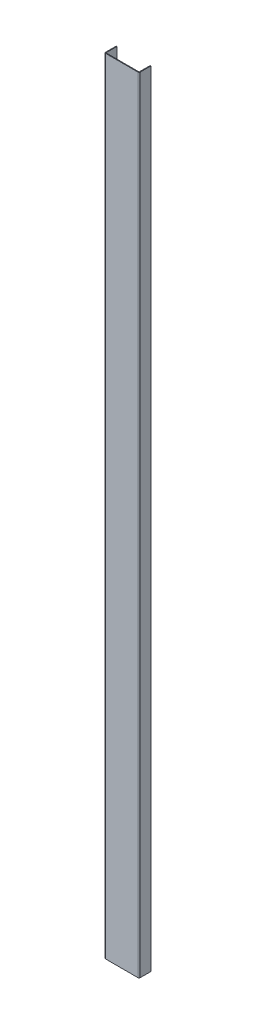
ISO-10303-21;
HEADER;
FILE_DESCRIPTION(('STEP AP214'),'2;1');
FILE_NAME('part.step','',(''),(''),'','','');
FILE_SCHEMA(('AUTOMOTIVE_DESIGN { 1 0 10303 214 1 1 1 1 }'));
ENDSEC;
DATA;
#1=APPLICATION_CONTEXT('core data for automotive mechanical design processes');
#2=APPLICATION_PROTOCOL_DEFINITION('international standard','automotive_design',2000,#1);
#3=PRODUCT_CONTEXT('',#1,'mechanical');
#4=PRODUCT('Part','Part','',(#3));
#5=PRODUCT_RELATED_PRODUCT_CATEGORY('part','',(#4));
#6=PRODUCT_DEFINITION_FORMATION('','',#4);
#7=PRODUCT_DEFINITION_CONTEXT('part definition',#1,'design');
#8=PRODUCT_DEFINITION('design','',#6,#7);
#9=PRODUCT_DEFINITION_SHAPE('','',#8);
#10=(LENGTH_UNIT() NAMED_UNIT(*) SI_UNIT(.MILLI.,.METRE.));
#11=(NAMED_UNIT(*) PLANE_ANGLE_UNIT() SI_UNIT($,.RADIAN.));
#12=(NAMED_UNIT(*) SI_UNIT($,.STERADIAN.) SOLID_ANGLE_UNIT());
#13=UNCERTAINTY_MEASURE_WITH_UNIT(LENGTH_MEASURE(1.E-05),#10,'distance_accuracy_value','');
#14=(GEOMETRIC_REPRESENTATION_CONTEXT(3) GLOBAL_UNCERTAINTY_ASSIGNED_CONTEXT((#13)) GLOBAL_UNIT_ASSIGNED_CONTEXT((#10,
#11,#12)) REPRESENTATION_CONTEXT('',''));
#15=CARTESIAN_POINT('',(0.,0.,0.));
#16=DIRECTION('',(0.,0.,1.));
#17=DIRECTION('',(1.,0.,0.));
#18=AXIS2_PLACEMENT_3D('',#15,#16,#17);
#19=CARTESIAN_POINT('',(-37.3633999999999,1803.4,12.7));
#20=DIRECTION('',(0.,1.,0.));
#21=DIRECTION('',(0.,0.,1.));
#22=AXIS2_PLACEMENT_3D('',#19,#20,#21);
#23=PLANE('',#22);
#24=DIRECTION('',(0.,0.,1.));
#25=VECTOR('',#24,1.);
#26=CARTESIAN_POINT('',(-37.3633999999999,1803.4,12.7));
#27=LINE('',#26,#25);
#28=CARTESIAN_POINT('',(-37.3633999999999,1803.4,12.7));
#29=VERTEX_POINT('',#28);
#30=CARTESIAN_POINT('',(-37.3633999999999,1803.4,14.2875));
#31=VERTEX_POINT('',#30);
#32=EDGE_CURVE('E11',#29,#31,#27,.T.);
#33=ORIENTED_EDGE('',*,*,#32,.F.);
#34=CARTESIAN_POINT('',(-37.3634,1803.4,11.9634));
#35=DIRECTION('',(0.,-1.,0.));
#36=DIRECTION('',(0.,0.,-1.));
#37=AXIS2_PLACEMENT_3D('',#34,#35,#36);
#38=CIRCLE('',#37,0.7366);
#39=CARTESIAN_POINT('',(-38.1,1803.4,11.9634));
#40=VERTEX_POINT('',#39);
#41=EDGE_CURVE('E245',#40,#29,#38,.F.);
#42=ORIENTED_EDGE('',*,*,#41,.F.);
#43=DIRECTION('',(1.,0.,0.));
#44=VECTOR('',#43,1.);
#45=CARTESIAN_POINT('',(-39.6875,1803.4,11.9634));
#46=LINE('',#45,#44);
#47=CARTESIAN_POINT('',(-39.6875,1803.4,11.9634));
#48=VERTEX_POINT('',#47);
#49=EDGE_CURVE('E43',#48,#40,#46,.T.);
#50=ORIENTED_EDGE('',*,*,#49,.F.);
#51=CARTESIAN_POINT('',(-37.3634,1803.4,11.9634));
#52=DIRECTION('',(0.,1.,0.));
#53=DIRECTION('',(1.,0.,0.));
#54=AXIS2_PLACEMENT_3D('',#51,#52,#53);
#55=CIRCLE('',#54,2.3241);
#56=EDGE_CURVE('E144',#48,#31,#55,.T.);
#57=ORIENTED_EDGE('',*,*,#56,.T.);
#58=EDGE_LOOP('',(#33,#42,#50,#57));
#59=FACE_BOUND('',#58,.T.);
#60=ADVANCED_FACE('F35',(#59),#23,.T.);
#61=CARTESIAN_POINT('',(-39.6875,1803.4,11.9634));
#62=DIRECTION('',(0.,1.,0.));
#63=DIRECTION('',(0.,0.,1.));
#64=AXIS2_PLACEMENT_3D('',#61,#62,#63);
#65=PLANE('',#64);
#66=DIRECTION('',(1.,0.,0.));
#67=VECTOR('',#66,1.);
#68=CARTESIAN_POINT('',(38.1,1803.4,12.7));
#69=LINE('',#68,#67);
#70=CARTESIAN_POINT('',(37.3634,1803.4,12.7));
#71=VERTEX_POINT('',#70);
#72=EDGE_CURVE('E138',#29,#71,#69,.T.);
#73=ORIENTED_EDGE('',*,*,#72,.F.);
#74=ORIENTED_EDGE('',*,*,#32,.T.);
#75=DIRECTION('',(1.,0.,0.));
#76=VECTOR('',#75,1.);
#77=CARTESIAN_POINT('',(38.1,1803.4,14.2875));
#78=LINE('',#77,#76);
#79=CARTESIAN_POINT('',(37.3634,1803.4,14.2875));
#80=VERTEX_POINT('',#79);
#81=EDGE_CURVE('E135',#31,#80,#78,.T.);
#82=ORIENTED_EDGE('',*,*,#81,.T.);
#83=DIRECTION('',(0.,0.,-1.));
#84=VECTOR('',#83,1.);
#85=CARTESIAN_POINT('',(37.3634,1803.4,14.2875));
#86=LINE('',#85,#84);
#87=EDGE_CURVE('E226',#80,#71,#86,.T.);
#88=ORIENTED_EDGE('',*,*,#87,.T.);
#89=EDGE_LOOP('',(#73,#74,#82,#88));
#90=FACE_BOUND('',#89,.T.);
#91=ADVANCED_FACE('F133',(#90),#65,.T.);
#92=CARTESIAN_POINT('',(-38.1,0.,11.9634));
#93=DIRECTION('',(0.,-1.,0.));
#94=DIRECTION('',(0.,0.,-1.));
#95=AXIS2_PLACEMENT_3D('',#92,#93,#94);
#96=PLANE('',#95);
#97=DIRECTION('',(-1.,0.,0.));
#98=VECTOR('',#97,1.);
#99=CARTESIAN_POINT('',(-38.1,0.,11.9634));
#100=LINE('',#99,#98);
#101=CARTESIAN_POINT('',(-38.1,0.,11.9634));
#102=VERTEX_POINT('',#101);
#103=CARTESIAN_POINT('',(-39.6875,0.,11.9634));
#104=VERTEX_POINT('',#103);
#105=EDGE_CURVE('E231',#102,#104,#100,.T.);
#106=ORIENTED_EDGE('',*,*,#105,.F.);
#107=CARTESIAN_POINT('',(-37.3634,0.,11.9634));
#108=DIRECTION('',(0.,-1.,0.));
#109=DIRECTION('',(0.,0.,-1.));
#110=AXIS2_PLACEMENT_3D('',#107,#108,#109);
#111=CIRCLE('',#110,0.7366);
#112=CARTESIAN_POINT('',(-37.3633999999999,0.,12.7));
#113=VERTEX_POINT('',#112);
#114=EDGE_CURVE('E183',#102,#113,#111,.F.);
#115=ORIENTED_EDGE('',*,*,#114,.T.);
#116=DIRECTION('',(0.,0.,-1.));
#117=VECTOR('',#116,1.);
#118=CARTESIAN_POINT('',(-37.3633999999999,0.,14.2875));
#119=LINE('',#118,#117);
#120=CARTESIAN_POINT('',(-37.3633999999999,0.,14.2875));
#121=VERTEX_POINT('',#120);
#122=EDGE_CURVE('E229',#121,#113,#119,.T.);
#123=ORIENTED_EDGE('',*,*,#122,.F.);
#124=CARTESIAN_POINT('',(-37.3634,0.,11.9634));
#125=DIRECTION('',(0.,1.,0.));
#126=DIRECTION('',(1.,0.,0.));
#127=AXIS2_PLACEMENT_3D('',#124,#125,#126);
#128=CIRCLE('',#127,2.3241);
#129=EDGE_CURVE('E156',#104,#121,#128,.T.);
#130=ORIENTED_EDGE('',*,*,#129,.F.);
#131=EDGE_LOOP('',(#106,#115,#123,#130));
#132=FACE_BOUND('',#131,.T.);
#133=ADVANCED_FACE('F283',(#132),#96,.T.);
#134=CARTESIAN_POINT('',(-37.3633999999999,0.,14.2875));
#135=DIRECTION('',(0.,-1.,0.));
#136=DIRECTION('',(0.,0.,-1.));
#137=AXIS2_PLACEMENT_3D('',#134,#135,#136);
#138=PLANE('',#137);
#139=DIRECTION('',(0.,0.,1.));
#140=VECTOR('',#139,1.);
#141=CARTESIAN_POINT('',(-38.1,0.,12.7));
#142=LINE('',#141,#140);
#143=CARTESIAN_POINT('',(-38.1,0.,-12.7));
#144=VERTEX_POINT('',#143);
#145=EDGE_CURVE('E186',#144,#102,#142,.T.);
#146=ORIENTED_EDGE('',*,*,#145,.T.);
#147=ORIENTED_EDGE('',*,*,#105,.T.);
#148=DIRECTION('',(0.,0.,-1.));
#149=VECTOR('',#148,1.);
#150=CARTESIAN_POINT('',(-39.6875,0.,12.7));
#151=LINE('',#150,#149);
#152=CARTESIAN_POINT('',(-39.6875,0.,-12.7));
#153=VERTEX_POINT('',#152);
#154=EDGE_CURVE('E192',#153,#104,#151,.F.);
#155=ORIENTED_EDGE('',*,*,#154,.F.);
#156=DIRECTION('',(1.,0.,0.));
#157=VECTOR('',#156,1.);
#158=CARTESIAN_POINT('',(-39.6875,0.,-12.7));
#159=LINE('',#158,#157);
#160=EDGE_CURVE('E189',#153,#144,#159,.T.);
#161=ORIENTED_EDGE('',*,*,#160,.T.);
#162=EDGE_LOOP('',(#146,#147,#155,#161));
#163=FACE_BOUND('',#162,.T.);
#164=ADVANCED_FACE('F286',(#163),#138,.T.);
#165=CARTESIAN_POINT('',(38.1,1803.4,11.9634));
#166=DIRECTION('',(0.,1.,0.));
#167=DIRECTION('',(0.,0.,1.));
#168=AXIS2_PLACEMENT_3D('',#165,#166,#167);
#169=PLANE('',#168);
#170=DIRECTION('',(1.,0.,0.));
#171=VECTOR('',#170,1.);
#172=CARTESIAN_POINT('',(38.1,1803.4,11.9634));
#173=LINE('',#172,#171);
#174=CARTESIAN_POINT('',(38.1,1803.4,11.9634));
#175=VERTEX_POINT('',#174);
#176=CARTESIAN_POINT('',(39.6875,1803.4,11.9634));
#177=VERTEX_POINT('',#176);
#178=EDGE_CURVE('E51',#175,#177,#173,.T.);
#179=ORIENTED_EDGE('',*,*,#178,.F.);
#180=CARTESIAN_POINT('',(37.3634,1803.4,11.9634));
#181=DIRECTION('',(0.,-1.,0.));
#182=DIRECTION('',(0.,0.,-1.));
#183=AXIS2_PLACEMENT_3D('',#180,#181,#182);
#184=CIRCLE('',#183,0.7366);
#185=EDGE_CURVE('E255',#71,#175,#184,.F.);
#186=ORIENTED_EDGE('',*,*,#185,.F.);
#187=ORIENTED_EDGE('',*,*,#87,.F.);
#188=CARTESIAN_POINT('',(37.3634,1803.4,11.9634));
#189=DIRECTION('',(0.,1.,0.));
#190=DIRECTION('',(1.,0.,0.));
#191=AXIS2_PLACEMENT_3D('',#188,#189,#190);
#192=CIRCLE('',#191,2.3241);
#193=EDGE_CURVE('E164',#80,#177,#192,.T.);
#194=ORIENTED_EDGE('',*,*,#193,.T.);
#195=EDGE_LOOP('',(#179,#186,#187,#194));
#196=FACE_BOUND('',#195,.T.);
#197=ADVANCED_FACE('F278',(#196),#169,.T.);
#198=CARTESIAN_POINT('',(37.3634,1803.4,14.2875));
#199=DIRECTION('',(0.,1.,0.));
#200=DIRECTION('',(0.,0.,1.));
#201=AXIS2_PLACEMENT_3D('',#198,#199,#200);
#202=PLANE('',#201);
#203=DIRECTION('',(0.,0.,-1.));
#204=VECTOR('',#203,1.);
#205=CARTESIAN_POINT('',(38.1,1803.4,12.7));
#206=LINE('',#205,#204);
#207=CARTESIAN_POINT('',(38.1,1803.4,-12.7));
#208=VERTEX_POINT('',#207);
#209=EDGE_CURVE('E258',#175,#208,#206,.T.);
#210=ORIENTED_EDGE('',*,*,#209,.F.);
#211=ORIENTED_EDGE('',*,*,#178,.T.);
#212=DIRECTION('',(0.,0.,-1.));
#213=VECTOR('',#212,1.);
#214=CARTESIAN_POINT('',(39.6875,1803.4,12.7));
#215=LINE('',#214,#213);
#216=CARTESIAN_POINT('',(39.6875,1803.4,-12.7));
#217=VERTEX_POINT('',#216);
#218=EDGE_CURVE('E105',#177,#217,#215,.T.);
#219=ORIENTED_EDGE('',*,*,#218,.T.);
#220=DIRECTION('',(1.,0.,0.));
#221=VECTOR('',#220,1.);
#222=CARTESIAN_POINT('',(38.1,1803.4,-12.7));
#223=LINE('',#222,#221);
#224=EDGE_CURVE('E261',#208,#217,#223,.T.);
#225=ORIENTED_EDGE('',*,*,#224,.F.);
#226=EDGE_LOOP('',(#210,#211,#219,#225));
#227=FACE_BOUND('',#226,.T.);
#228=ADVANCED_FACE('F267',(#227),#202,.T.);
#229=CARTESIAN_POINT('',(37.3634,0.,12.7));
#230=DIRECTION('',(0.,-1.,0.));
#231=DIRECTION('',(0.,0.,-1.));
#232=AXIS2_PLACEMENT_3D('',#229,#230,#231);
#233=PLANE('',#232);
#234=DIRECTION('',(0.,0.,1.));
#235=VECTOR('',#234,1.);
#236=CARTESIAN_POINT('',(37.3634,0.,12.7));
#237=LINE('',#236,#235);
#238=CARTESIAN_POINT('',(37.3634,0.,12.7));
#239=VERTEX_POINT('',#238);
#240=CARTESIAN_POINT('',(37.3634,0.,14.2875));
#241=VERTEX_POINT('',#240);
#242=EDGE_CURVE('E92',#239,#241,#237,.T.);
#243=ORIENTED_EDGE('',*,*,#242,.F.);
#244=CARTESIAN_POINT('',(37.3634,0.,11.9634));
#245=DIRECTION('',(0.,-1.,0.));
#246=DIRECTION('',(0.,0.,-1.));
#247=AXIS2_PLACEMENT_3D('',#244,#245,#246);
#248=CIRCLE('',#247,0.7366);
#249=CARTESIAN_POINT('',(38.1,0.,11.9634));
#250=VERTEX_POINT('',#249);
#251=EDGE_CURVE('E179',#239,#250,#248,.F.);
#252=ORIENTED_EDGE('',*,*,#251,.T.);
#253=DIRECTION('',(-1.,0.,0.));
#254=VECTOR('',#253,1.);
#255=CARTESIAN_POINT('',(39.6875,0.,11.9634));
#256=LINE('',#255,#254);
#257=CARTESIAN_POINT('',(39.6875,0.,11.9634));
#258=VERTEX_POINT('',#257);
#259=EDGE_CURVE('E99',#258,#250,#256,.T.);
#260=ORIENTED_EDGE('',*,*,#259,.F.);
#261=CARTESIAN_POINT('',(37.3634,0.,11.9634));
#262=DIRECTION('',(0.,1.,0.));
#263=DIRECTION('',(1.,0.,0.));
#264=AXIS2_PLACEMENT_3D('',#261,#262,#263);
#265=CIRCLE('',#264,2.3241);
#266=EDGE_CURVE('E198',#241,#258,#265,.T.);
#267=ORIENTED_EDGE('',*,*,#266,.F.);
#268=EDGE_LOOP('',(#243,#252,#260,#267));
#269=FACE_BOUND('',#268,.T.);
#270=ADVANCED_FACE('F315',(#269),#233,.T.);
#271=CARTESIAN_POINT('',(39.6875,0.,11.9634));
#272=DIRECTION('',(0.,-1.,0.));
#273=DIRECTION('',(0.,0.,-1.));
#274=AXIS2_PLACEMENT_3D('',#271,#272,#273);
#275=PLANE('',#274);
#276=DIRECTION('',(1.,0.,0.));
#277=VECTOR('',#276,1.);
#278=CARTESIAN_POINT('',(38.1,0.,12.7));
#279=LINE('',#278,#277);
#280=EDGE_CURVE('E181',#113,#239,#279,.T.);
#281=ORIENTED_EDGE('',*,*,#280,.T.);
#282=ORIENTED_EDGE('',*,*,#242,.T.);
#283=DIRECTION('',(1.,0.,0.));
#284=VECTOR('',#283,1.);
#285=CARTESIAN_POINT('',(38.1,0.,14.2875));
#286=LINE('',#285,#284);
#287=EDGE_CURVE('E196',#121,#241,#286,.T.);
#288=ORIENTED_EDGE('',*,*,#287,.F.);
#289=ORIENTED_EDGE('',*,*,#122,.T.);
#290=EDGE_LOOP('',(#281,#282,#288,#289));
#291=FACE_BOUND('',#290,.T.);
#292=ADVANCED_FACE('F318',(#291),#275,.T.);
#293=CARTESIAN_POINT('',(39.6875,1803.4,12.7));
#294=DIRECTION('',(-1.,0.,0.));
#295=DIRECTION('',(0.,0.,1.));
#296=AXIS2_PLACEMENT_3D('',#293,#294,#295);
#297=PLANE('',#296);
#298=DIRECTION('',(0.,0.,-1.));
#299=VECTOR('',#298,1.);
#300=CARTESIAN_POINT('',(39.6875,0.,12.7));
#301=LINE('',#300,#299);
#302=CARTESIAN_POINT('',(39.6875,0.,-12.7));
#303=VERTEX_POINT('',#302);
#304=EDGE_CURVE('E170',#258,#303,#301,.T.);
#305=ORIENTED_EDGE('',*,*,#304,.T.);
#306=DIRECTION('',(0.,-1.,0.));
#307=VECTOR('',#306,1.);
#308=CARTESIAN_POINT('',(39.6875,1803.4,-12.7));
#309=LINE('',#308,#307);
#310=EDGE_CURVE('E222',#217,#303,#309,.T.);
#311=ORIENTED_EDGE('',*,*,#310,.F.);
#312=ORIENTED_EDGE('',*,*,#218,.F.);
#313=DIRECTION('',(0.,-1.,0.));
#314=VECTOR('',#313,1.);
#315=CARTESIAN_POINT('',(39.6875,1803.4,11.9634));
#316=LINE('',#315,#314);
#317=EDGE_CURVE('E166',#177,#258,#316,.T.);
#318=ORIENTED_EDGE('',*,*,#317,.T.);
#319=EDGE_LOOP('',(#305,#311,#312,#318));
#320=FACE_BOUND('',#319,.T.);
#321=ADVANCED_FACE('F321',(#320),#297,.F.);
#322=CARTESIAN_POINT('',(38.1,1803.4,-12.7));
#323=DIRECTION('',(0.,0.,-1.));
#324=DIRECTION('',(-1.,0.,0.));
#325=AXIS2_PLACEMENT_3D('',#322,#323,#324);
#326=PLANE('',#325);
#327=DIRECTION('',(1.,0.,0.));
#328=VECTOR('',#327,1.);
#329=CARTESIAN_POINT('',(38.1,0.,-12.7));
#330=LINE('',#329,#328);
#331=CARTESIAN_POINT('',(38.1,0.,-12.7));
#332=VERTEX_POINT('',#331);
#333=EDGE_CURVE('E173',#332,#303,#330,.T.);
#334=ORIENTED_EDGE('',*,*,#333,.F.);
#335=DIRECTION('',(0.,-1.,0.));
#336=VECTOR('',#335,1.);
#337=CARTESIAN_POINT('',(38.1,1803.4,-12.7));
#338=LINE('',#337,#336);
#339=EDGE_CURVE('E220',#208,#332,#338,.T.);
#340=ORIENTED_EDGE('',*,*,#339,.F.);
#341=ORIENTED_EDGE('',*,*,#224,.T.);
#342=ORIENTED_EDGE('',*,*,#310,.T.);
#343=EDGE_LOOP('',(#334,#340,#341,#342));
#344=FACE_BOUND('',#343,.T.);
#345=ADVANCED_FACE('F266',(#344),#326,.T.);
#346=CARTESIAN_POINT('',(38.1,1803.4,12.7));
#347=DIRECTION('',(-1.,0.,0.));
#348=DIRECTION('',(0.,0.,1.));
#349=AXIS2_PLACEMENT_3D('',#346,#347,#348);
#350=PLANE('',#349);
#351=DIRECTION('',(0.,0.,-1.));
#352=VECTOR('',#351,1.);
#353=CARTESIAN_POINT('',(38.1,0.,12.7));
#354=LINE('',#353,#352);
#355=EDGE_CURVE('E176',#250,#332,#354,.T.);
#356=ORIENTED_EDGE('',*,*,#355,.F.);
#357=DIRECTION('',(0.,-1.,0.));
#358=VECTOR('',#357,1.);
#359=CARTESIAN_POINT('',(38.1,1803.4,11.9634));
#360=LINE('',#359,#358);
#361=EDGE_CURVE('E217',#175,#250,#360,.T.);
#362=ORIENTED_EDGE('',*,*,#361,.F.);
#363=ORIENTED_EDGE('',*,*,#209,.T.);
#364=ORIENTED_EDGE('',*,*,#339,.T.);
#365=EDGE_LOOP('',(#356,#362,#363,#364));
#366=FACE_BOUND('',#365,.T.);
#367=ADVANCED_FACE('F271',(#366),#350,.T.);
#368=CARTESIAN_POINT('',(37.3634,1803.4,11.9634));
#369=DIRECTION('',(0.,-1.,0.));
#370=DIRECTION('',(0.,0.,-1.));
#371=AXIS2_PLACEMENT_3D('',#368,#369,#370);
#372=CYLINDRICAL_SURFACE('',#371,0.7366);
#373=ORIENTED_EDGE('',*,*,#251,.F.);
#374=DIRECTION('',(0.,-1.,0.));
#375=VECTOR('',#374,1.);
#376=CARTESIAN_POINT('',(37.3634,1803.4,12.7));
#377=LINE('',#376,#375);
#378=EDGE_CURVE('E214',#71,#239,#377,.T.);
#379=ORIENTED_EDGE('',*,*,#378,.F.);
#380=ORIENTED_EDGE('',*,*,#185,.T.);
#381=ORIENTED_EDGE('',*,*,#361,.T.);
#382=EDGE_LOOP('',(#373,#379,#380,#381));
#383=FACE_BOUND('',#382,.T.);
#384=ADVANCED_FACE('F274',(#383),#372,.F.);
#385=CARTESIAN_POINT('',(38.1,1803.4,12.7));
#386=DIRECTION('',(0.,0.,-1.));
#387=DIRECTION('',(-1.,0.,0.));
#388=AXIS2_PLACEMENT_3D('',#385,#386,#387);
#389=PLANE('',#388);
#390=ORIENTED_EDGE('',*,*,#280,.F.);
#391=DIRECTION('',(0.,-1.,0.));
#392=VECTOR('',#391,1.);
#393=CARTESIAN_POINT('',(-37.3633999999999,1803.4,12.7));
#394=LINE('',#393,#392);
#395=EDGE_CURVE('E211',#29,#113,#394,.T.);
#396=ORIENTED_EDGE('',*,*,#395,.F.);
#397=ORIENTED_EDGE('',*,*,#72,.T.);
#398=ORIENTED_EDGE('',*,*,#378,.T.);
#399=EDGE_LOOP('',(#390,#396,#397,#398));
#400=FACE_BOUND('',#399,.T.);
#401=ADVANCED_FACE('F281',(#400),#389,.T.);
#402=CARTESIAN_POINT('',(-37.3634,1803.4,11.9634));
#403=DIRECTION('',(0.,-1.,0.));
#404=DIRECTION('',(0.,0.,-1.));
#405=AXIS2_PLACEMENT_3D('',#402,#403,#404);
#406=CYLINDRICAL_SURFACE('',#405,0.7366);
#407=ORIENTED_EDGE('',*,*,#114,.F.);
#408=DIRECTION('',(0.,-1.,0.));
#409=VECTOR('',#408,1.);
#410=CARTESIAN_POINT('',(-38.1,1803.4,11.9634));
#411=LINE('',#410,#409);
#412=EDGE_CURVE('E208',#40,#102,#411,.T.);
#413=ORIENTED_EDGE('',*,*,#412,.F.);
#414=ORIENTED_EDGE('',*,*,#41,.T.);
#415=ORIENTED_EDGE('',*,*,#395,.T.);
#416=EDGE_LOOP('',(#407,#413,#414,#415));
#417=FACE_BOUND('',#416,.T.);
#418=ADVANCED_FACE('F244',(#417),#406,.F.);
#419=CARTESIAN_POINT('',(-38.1,1803.4,12.7));
#420=DIRECTION('',(1.,0.,0.));
#421=DIRECTION('',(0.,0.,-1.));
#422=AXIS2_PLACEMENT_3D('',#419,#420,#421);
#423=PLANE('',#422);
#424=ORIENTED_EDGE('',*,*,#145,.F.);
#425=DIRECTION('',(0.,-1.,0.));
#426=VECTOR('',#425,1.);
#427=CARTESIAN_POINT('',(-38.1,1803.4,-12.7));
#428=LINE('',#427,#426);
#429=CARTESIAN_POINT('',(-38.1,1803.4,-12.7));
#430=VERTEX_POINT('',#429);
#431=EDGE_CURVE('E206',#430,#144,#428,.T.);
#432=ORIENTED_EDGE('',*,*,#431,.F.);
#433=DIRECTION('',(0.,0.,1.));
#434=VECTOR('',#433,1.);
#435=CARTESIAN_POINT('',(-38.1,1803.4,12.7));
#436=LINE('',#435,#434);
#437=EDGE_CURVE('E238',#430,#40,#436,.T.);
#438=ORIENTED_EDGE('',*,*,#437,.T.);
#439=ORIENTED_EDGE('',*,*,#412,.T.);
#440=EDGE_LOOP('',(#424,#432,#438,#439));
#441=FACE_BOUND('',#440,.T.);
#442=ADVANCED_FACE('F249',(#441),#423,.T.);
#443=CARTESIAN_POINT('',(-39.6875,1803.4,-12.7));
#444=DIRECTION('',(0.,0.,-1.));
#445=DIRECTION('',(-1.,0.,0.));
#446=AXIS2_PLACEMENT_3D('',#443,#444,#445);
#447=PLANE('',#446);
#448=ORIENTED_EDGE('',*,*,#160,.F.);
#449=DIRECTION('',(0.,-1.,0.));
#450=VECTOR('',#449,1.);
#451=CARTESIAN_POINT('',(-39.6875,1803.4,-12.7));
#452=LINE('',#451,#450);
#453=CARTESIAN_POINT('',(-39.6875,1803.4,-12.7));
#454=VERTEX_POINT('',#453);
#455=EDGE_CURVE('E204',#454,#153,#452,.T.);
#456=ORIENTED_EDGE('',*,*,#455,.F.);
#457=DIRECTION('',(1.,0.,0.));
#458=VECTOR('',#457,1.);
#459=CARTESIAN_POINT('',(-39.6875,1803.4,-12.7));
#460=LINE('',#459,#458);
#461=EDGE_CURVE('E250',#454,#430,#460,.T.);
#462=ORIENTED_EDGE('',*,*,#461,.T.);
#463=ORIENTED_EDGE('',*,*,#431,.T.);
#464=EDGE_LOOP('',(#448,#456,#462,#463));
#465=FACE_BOUND('',#464,.T.);
#466=ADVANCED_FACE('F291',(#465),#447,.T.);
#467=CARTESIAN_POINT('',(-39.6875,1803.4,12.7));
#468=DIRECTION('',(1.,0.,0.));
#469=DIRECTION('',(0.,0.,-1.));
#470=AXIS2_PLACEMENT_3D('',#467,#468,#469);
#471=PLANE('',#470);
#472=ORIENTED_EDGE('',*,*,#154,.T.);
#473=DIRECTION('',(0.,-1.,0.));
#474=VECTOR('',#473,1.);
#475=CARTESIAN_POINT('',(-39.6875,1803.4,11.9634));
#476=LINE('',#475,#474);
#477=EDGE_CURVE('E158',#48,#104,#476,.T.);
#478=ORIENTED_EDGE('',*,*,#477,.F.);
#479=DIRECTION('',(0.,0.,-1.));
#480=VECTOR('',#479,1.);
#481=CARTESIAN_POINT('',(-39.6875,1803.4,12.7));
#482=LINE('',#481,#480);
#483=EDGE_CURVE('E149',#454,#48,#482,.F.);
#484=ORIENTED_EDGE('',*,*,#483,.F.);
#485=ORIENTED_EDGE('',*,*,#455,.T.);
#486=EDGE_LOOP('',(#472,#478,#484,#485));
#487=FACE_BOUND('',#486,.T.);
#488=ADVANCED_FACE('F289',(#487),#471,.F.);
#489=CARTESIAN_POINT('',(-37.3634,1803.4,11.9634));
#490=DIRECTION('',(0.,-1.,0.));
#491=DIRECTION('',(0.,0.,-1.));
#492=AXIS2_PLACEMENT_3D('',#489,#490,#491);
#493=CYLINDRICAL_SURFACE('',#492,2.3241);
#494=ORIENTED_EDGE('',*,*,#129,.T.);
#495=DIRECTION('',(0.,-1.,0.));
#496=VECTOR('',#495,1.);
#497=CARTESIAN_POINT('',(-37.3633999999999,1803.4,14.2875));
#498=LINE('',#497,#496);
#499=EDGE_CURVE('E153',#31,#121,#498,.T.);
#500=ORIENTED_EDGE('',*,*,#499,.F.);
#501=ORIENTED_EDGE('',*,*,#56,.F.);
#502=ORIENTED_EDGE('',*,*,#477,.T.);
#503=EDGE_LOOP('',(#494,#500,#501,#502));
#504=FACE_BOUND('',#503,.T.);
#505=ADVANCED_FACE('F154',(#504),#493,.T.);
#506=CARTESIAN_POINT('',(38.1,1803.4,14.2875));
#507=DIRECTION('',(0.,0.,-1.));
#508=DIRECTION('',(-1.,0.,0.));
#509=AXIS2_PLACEMENT_3D('',#506,#507,#508);
#510=PLANE('',#509);
#511=ORIENTED_EDGE('',*,*,#287,.T.);
#512=DIRECTION('',(0.,-1.,0.));
#513=VECTOR('',#512,1.);
#514=CARTESIAN_POINT('',(37.3634,1803.4,14.2875));
#515=LINE('',#514,#513);
#516=EDGE_CURVE('E159',#80,#241,#515,.T.);
#517=ORIENTED_EDGE('',*,*,#516,.F.);
#518=ORIENTED_EDGE('',*,*,#81,.F.);
#519=ORIENTED_EDGE('',*,*,#499,.T.);
#520=EDGE_LOOP('',(#511,#517,#518,#519));
#521=FACE_BOUND('',#520,.T.);
#522=ADVANCED_FACE('F161',(#521),#510,.F.);
#523=CARTESIAN_POINT('',(37.3634,1803.4,11.9634));
#524=DIRECTION('',(0.,-1.,0.));
#525=DIRECTION('',(0.,0.,-1.));
#526=AXIS2_PLACEMENT_3D('',#523,#524,#525);
#527=CYLINDRICAL_SURFACE('',#526,2.3241);
#528=ORIENTED_EDGE('',*,*,#266,.T.);
#529=ORIENTED_EDGE('',*,*,#317,.F.);
#530=ORIENTED_EDGE('',*,*,#193,.F.);
#531=ORIENTED_EDGE('',*,*,#516,.T.);
#532=EDGE_LOOP('',(#528,#529,#530,#531));
#533=FACE_BOUND('',#532,.T.);
#534=ADVANCED_FACE('F373',(#533),#527,.T.);
#535=CARTESIAN_POINT('',(37.3634,1803.4,11.9634));
#536=DIRECTION('',(0.,-1.,0.));
#537=DIRECTION('',(-1.,0.,0.));
#538=AXIS2_PLACEMENT_3D('',#535,#536,#537);
#539=PLANE('',#538);
#540=ORIENTED_EDGE('',*,*,#483,.T.);
#541=ORIENTED_EDGE('',*,*,#49,.T.);
#542=ORIENTED_EDGE('',*,*,#437,.F.);
#543=ORIENTED_EDGE('',*,*,#461,.F.);
#544=EDGE_LOOP('',(#540,#541,#542,#543));
#545=FACE_BOUND('',#544,.T.);
#546=ADVANCED_FACE('F235',(#545),#539,.F.);
#547=CARTESIAN_POINT('',(37.3634,0.,11.9634));
#548=DIRECTION('',(0.,-1.,0.));
#549=DIRECTION('',(-1.,0.,0.));
#550=AXIS2_PLACEMENT_3D('',#547,#548,#549);
#551=PLANE('',#550);
#552=ORIENTED_EDGE('',*,*,#304,.F.);
#553=ORIENTED_EDGE('',*,*,#259,.T.);
#554=ORIENTED_EDGE('',*,*,#355,.T.);
#555=ORIENTED_EDGE('',*,*,#333,.T.);
#556=EDGE_LOOP('',(#552,#553,#554,#555));
#557=FACE_BOUND('',#556,.T.);
#558=ADVANCED_FACE('F393',(#557),#551,.T.);
#559=CLOSED_SHELL('',(#60,#91,#133,#164,#197,#228,#270,#292,#321,#345,#367,#384,#401,#418,#442,
#466,#488,#505,#522,#534,#546,#558));
#560=MANIFOLD_SOLID_BREP('B2',#559);
#561=ADVANCED_BREP_SHAPE_REPRESENTATION('',(#18,#560),#14);
#562=SHAPE_DEFINITION_REPRESENTATION(#9,#561);
ENDSEC;
END-ISO-10303-21;
